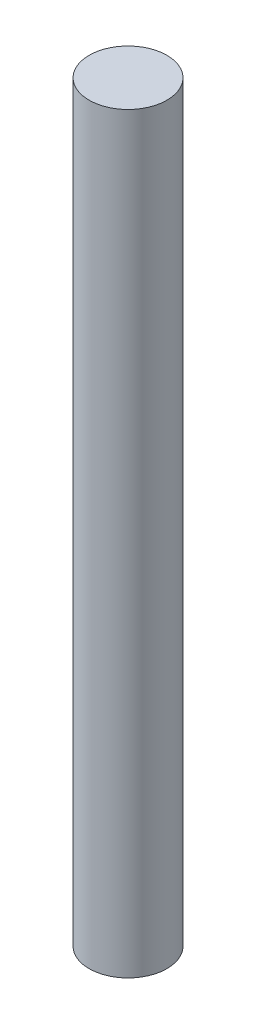
ISO-10303-21;
HEADER;
FILE_DESCRIPTION(('STEP AP214'),'2;1');
FILE_NAME('part.step','',(''),(''),'','','');
FILE_SCHEMA(('AUTOMOTIVE_DESIGN { 1 0 10303 214 1 1 1 1 }'));
ENDSEC;
DATA;
#1=APPLICATION_CONTEXT('core data for automotive mechanical design processes');
#2=APPLICATION_PROTOCOL_DEFINITION('international standard','automotive_design',2000,#1);
#3=PRODUCT_CONTEXT('',#1,'mechanical');
#4=PRODUCT('Part','Part','',(#3));
#5=PRODUCT_RELATED_PRODUCT_CATEGORY('part','',(#4));
#6=PRODUCT_DEFINITION_FORMATION('','',#4);
#7=PRODUCT_DEFINITION_CONTEXT('part definition',#1,'design');
#8=PRODUCT_DEFINITION('design','',#6,#7);
#9=PRODUCT_DEFINITION_SHAPE('','',#8);
#10=(LENGTH_UNIT() NAMED_UNIT(*) SI_UNIT(.MILLI.,.METRE.));
#11=(NAMED_UNIT(*) PLANE_ANGLE_UNIT() SI_UNIT($,.RADIAN.));
#12=(NAMED_UNIT(*) SI_UNIT($,.STERADIAN.) SOLID_ANGLE_UNIT());
#13=UNCERTAINTY_MEASURE_WITH_UNIT(LENGTH_MEASURE(1.E-05),#10,'distance_accuracy_value','');
#14=(GEOMETRIC_REPRESENTATION_CONTEXT(3) GLOBAL_UNCERTAINTY_ASSIGNED_CONTEXT((#13)) GLOBAL_UNIT_ASSIGNED_CONTEXT((#10,
#11,#12)) REPRESENTATION_CONTEXT('',''));
#15=CARTESIAN_POINT('',(0.,0.,0.));
#16=DIRECTION('',(0.,0.,1.));
#17=DIRECTION('',(1.,0.,0.));
#18=AXIS2_PLACEMENT_3D('',#15,#16,#17);
#19=CARTESIAN_POINT('',(0.,58.,0.));
#20=DIRECTION('',(0.,-1.,0.));
#21=DIRECTION('',(0.,0.,-1.));
#22=AXIS2_PLACEMENT_3D('',#19,#20,#21);
#23=CYLINDRICAL_SURFACE('',#22,3.);
#24=CARTESIAN_POINT('',(0.,58.,0.));
#25=DIRECTION('',(0.,1.,0.));
#26=DIRECTION('',(0.,0.,1.));
#27=AXIS2_PLACEMENT_3D('',#24,#25,#26);
#28=CIRCLE('',#27,3.);
#29=CARTESIAN_POINT('',(0.,58.,-3.));
#30=VERTEX_POINT('',#29);
#31=EDGE_CURVE('E10',#30,#30,#28,.T.);
#32=CARTESIAN_POINT('',(0.,0.,0.));
#33=DIRECTION('',(0.,1.,0.));
#34=DIRECTION('',(0.,0.,1.));
#35=AXIS2_PLACEMENT_3D('',#32,#33,#34);
#36=CIRCLE('',#35,3.);
#37=CARTESIAN_POINT('',(0.,0.,-3.));
#38=VERTEX_POINT('',#37);
#39=EDGE_CURVE('E38',#38,#38,#36,.T.);
#40=CARTESIAN_POINT('',(0.,58.,-3.));
#41=CARTESIAN_POINT('',(0.,57.3958333333333,-3.));
#42=CARTESIAN_POINT('',(0.,56.7916666666667,-3.));
#43=CARTESIAN_POINT('',(0.,55.5833333333333,-3.));
#44=CARTESIAN_POINT('',(0.,54.9791666666667,-3.));
#45=CARTESIAN_POINT('',(0.,53.7708333333333,-3.));
#46=CARTESIAN_POINT('',(0.,53.1666666666667,-3.));
#47=CARTESIAN_POINT('',(0.,51.9583333333333,-3.));
#48=CARTESIAN_POINT('',(0.,51.3541666666667,-3.));
#49=CARTESIAN_POINT('',(0.,50.1458333333333,-3.));
#50=CARTESIAN_POINT('',(0.,49.5416666666667,-3.));
#51=CARTESIAN_POINT('',(0.,48.3333333333333,-3.));
#52=CARTESIAN_POINT('',(0.,47.7291666666667,-3.));
#53=CARTESIAN_POINT('',(0.,46.5208333333333,-3.));
#54=CARTESIAN_POINT('',(0.,45.9166666666667,-3.));
#55=CARTESIAN_POINT('',(0.,44.7083333333333,-3.));
#56=CARTESIAN_POINT('',(0.,44.1041666666667,-3.));
#57=CARTESIAN_POINT('',(0.,42.8958333333333,-3.));
#58=CARTESIAN_POINT('',(0.,42.2916666666667,-3.));
#59=CARTESIAN_POINT('',(0.,41.0833333333333,-3.));
#60=CARTESIAN_POINT('',(0.,40.4791666666667,-3.));
#61=CARTESIAN_POINT('',(0.,39.2708333333333,-3.));
#62=CARTESIAN_POINT('',(0.,38.6666666666667,-3.));
#63=CARTESIAN_POINT('',(0.,37.4583333333333,-3.));
#64=CARTESIAN_POINT('',(0.,36.8541666666667,-3.));
#65=CARTESIAN_POINT('',(0.,35.6458333333333,-3.));
#66=CARTESIAN_POINT('',(0.,35.0416666666667,-3.));
#67=CARTESIAN_POINT('',(0.,33.8333333333333,-3.));
#68=CARTESIAN_POINT('',(0.,33.2291666666667,-3.));
#69=CARTESIAN_POINT('',(0.,32.0208333333333,-3.));
#70=CARTESIAN_POINT('',(0.,31.4166666666667,-3.));
#71=CARTESIAN_POINT('',(0.,30.2083333333333,-3.));
#72=CARTESIAN_POINT('',(0.,29.6041666666667,-3.));
#73=CARTESIAN_POINT('',(0.,28.3958333333333,-3.));
#74=CARTESIAN_POINT('',(0.,27.7916666666667,-3.));
#75=CARTESIAN_POINT('',(0.,26.5833333333333,-3.));
#76=CARTESIAN_POINT('',(0.,25.9791666666667,-3.));
#77=CARTESIAN_POINT('',(0.,24.7708333333333,-3.));
#78=CARTESIAN_POINT('',(0.,24.1666666666667,-3.));
#79=CARTESIAN_POINT('',(0.,22.9583333333333,-3.));
#80=CARTESIAN_POINT('',(0.,22.3541666666667,-3.));
#81=CARTESIAN_POINT('',(0.,21.1458333333333,-3.));
#82=CARTESIAN_POINT('',(0.,20.5416666666667,-3.));
#83=CARTESIAN_POINT('',(0.,19.3333333333333,-3.));
#84=CARTESIAN_POINT('',(0.,18.7291666666667,-3.));
#85=CARTESIAN_POINT('',(0.,17.5208333333333,-3.));
#86=CARTESIAN_POINT('',(0.,16.9166666666667,-3.));
#87=CARTESIAN_POINT('',(0.,15.7083333333333,-3.));
#88=CARTESIAN_POINT('',(0.,15.1041666666667,-3.));
#89=CARTESIAN_POINT('',(0.,13.8958333333333,-3.));
#90=CARTESIAN_POINT('',(0.,13.2916666666667,-3.));
#91=CARTESIAN_POINT('',(0.,12.0833333333333,-3.));
#92=CARTESIAN_POINT('',(0.,11.4791666666667,-3.));
#93=CARTESIAN_POINT('',(0.,10.2708333333333,-3.));
#94=CARTESIAN_POINT('',(0.,9.66666666666667,-3.));
#95=CARTESIAN_POINT('',(0.,8.45833333333333,-3.));
#96=CARTESIAN_POINT('',(0.,7.85416666666667,-3.));
#97=CARTESIAN_POINT('',(0.,6.64583333333333,-3.));
#98=CARTESIAN_POINT('',(0.,6.04166666666667,-3.));
#99=CARTESIAN_POINT('',(0.,4.83333333333333,-3.));
#100=CARTESIAN_POINT('',(0.,4.22916666666667,-3.));
#101=CARTESIAN_POINT('',(0.,3.02083333333334,-3.));
#102=CARTESIAN_POINT('',(0.,2.41666666666667,-3.));
#103=CARTESIAN_POINT('',(0.,1.20833333333333,-3.));
#104=CARTESIAN_POINT('',(0.,0.604166666666666,-3.));
#105=CARTESIAN_POINT('',(0.,0.,-3.));
#106=B_SPLINE_CURVE_WITH_KNOTS('',3,(#40,#41,#42,#43,#44,#45,#46,#47,#48,#49,#50,#51,#52,#53,
#54,#55,#56,#57,#58,#59,#60,#61,#62,#63,#64,#65,#66,#67,#68,#69,#70,#71,#72,#73,#74,#75,#76,#77,
#78,#79,#80,#81,#82,#83,#84,#85,#86,#87,#88,#89,#90,#91,#92,#93,#94,#95,#96,#97,#98,#99,#100,
#101,#102,#103,#104,#105),.UNSPECIFIED.,.F.,.F.,(4,2,2,2,2,2,2,2,2,2,2,2,2,2,2,2,2,2,2,2,2,2,2,
2,2,2,2,2,2,2,2,2,4),(0.,1.8125,3.625,5.4375,7.25000000000001,9.0625,10.875,12.6875,14.5,
16.3125,18.125,19.9375,21.75,23.5625,25.375,27.1875,29.,30.8125,32.625,34.4375,36.25,38.0625,
39.875,41.6875,43.5,45.3125,47.125,48.9375,50.75,52.5625,54.375,56.1875,58.),.UNSPECIFIED.);
#107=EDGE_CURVE('BSEAM35',#30,#38,#106,.T.);
#108=ORIENTED_EDGE('',*,*,#31,.F.);
#109=ORIENTED_EDGE('',*,*,#39,.T.);
#110=ORIENTED_EDGE('',*,*,#107,.T.);
#111=ORIENTED_EDGE('',*,*,#107,.F.);
#112=EDGE_LOOP('',(#108,#110,#109,#111));
#113=FACE_BOUND('',#112,.T.);
#114=ADVANCED_FACE('F35',(#113),#23,.T.);
#115=CARTESIAN_POINT('',(0.,58.,0.));
#116=DIRECTION('',(0.,1.,0.));
#117=DIRECTION('',(0.,0.,1.));
#118=AXIS2_PLACEMENT_3D('',#115,#116,#117);
#119=PLANE('',#118);
#120=ORIENTED_EDGE('',*,*,#31,.T.);
#121=EDGE_LOOP('',(#120));
#122=FACE_BOUND('',#121,.T.);
#123=ADVANCED_FACE('F50',(#122),#119,.T.);
#124=CARTESIAN_POINT('',(0.,0.,0.));
#125=DIRECTION('',(0.,1.,0.));
#126=DIRECTION('',(0.,0.,1.));
#127=AXIS2_PLACEMENT_3D('',#124,#125,#126);
#128=PLANE('',#127);
#129=ORIENTED_EDGE('',*,*,#39,.F.);
#130=EDGE_LOOP('',(#129));
#131=FACE_BOUND('',#130,.T.);
#132=ADVANCED_FACE('F48',(#131),#128,.F.);
#133=CLOSED_SHELL('',(#114,#123,#132));
#134=MANIFOLD_SOLID_BREP('B2',#133);
#135=ADVANCED_BREP_SHAPE_REPRESENTATION('',(#18,#134),#14);
#136=SHAPE_DEFINITION_REPRESENTATION(#9,#135);
ENDSEC;
END-ISO-10303-21;
